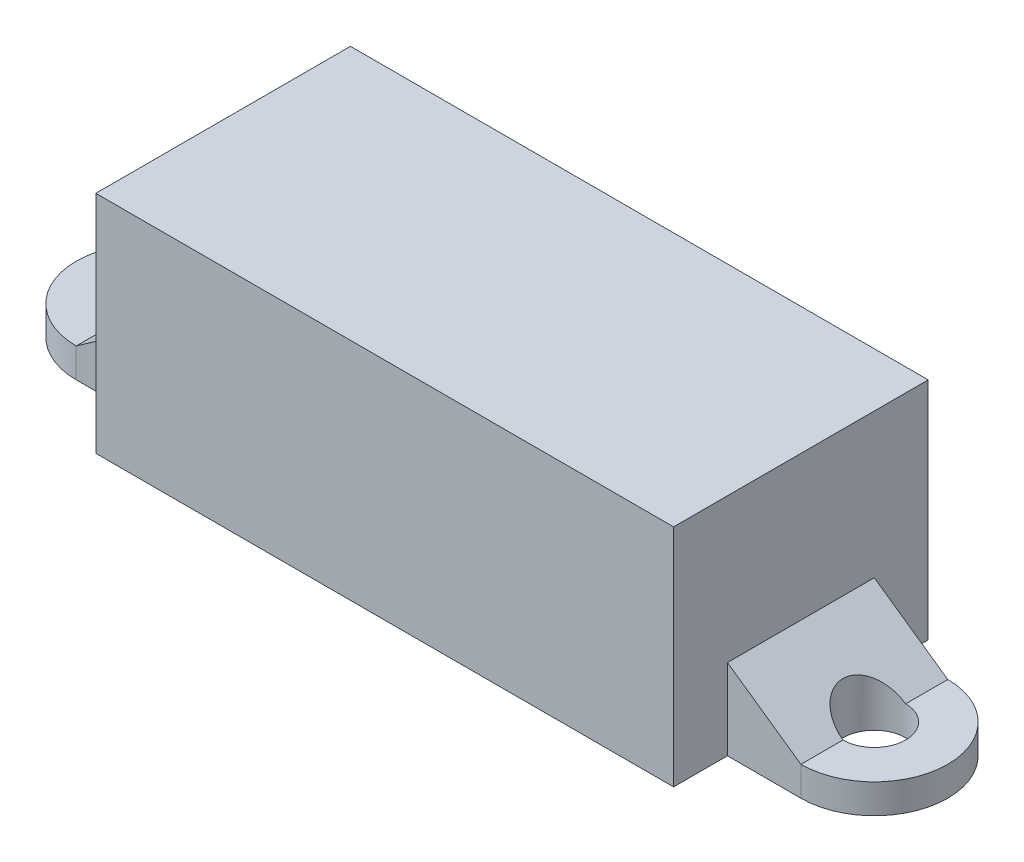
ISO-10303-21;
HEADER;
FILE_DESCRIPTION(('STEP AP214'),'2;1');
FILE_NAME('part.step','',(''),(''),'','','');
FILE_SCHEMA(('AUTOMOTIVE_DESIGN { 1 0 10303 214 1 1 1 1 }'));
ENDSEC;
DATA;
#1=APPLICATION_CONTEXT('core data for automotive mechanical design processes');
#2=APPLICATION_PROTOCOL_DEFINITION('international standard','automotive_design',2000,#1);
#3=PRODUCT_CONTEXT('',#1,'mechanical');
#4=PRODUCT('Part','Part','',(#3));
#5=PRODUCT_RELATED_PRODUCT_CATEGORY('part','',(#4));
#6=PRODUCT_DEFINITION_FORMATION('','',#4);
#7=PRODUCT_DEFINITION_CONTEXT('part definition',#1,'design');
#8=PRODUCT_DEFINITION('design','',#6,#7);
#9=PRODUCT_DEFINITION_SHAPE('','',#8);
#10=(LENGTH_UNIT() NAMED_UNIT(*) SI_UNIT(.MILLI.,.METRE.));
#11=(NAMED_UNIT(*) PLANE_ANGLE_UNIT() SI_UNIT($,.RADIAN.));
#12=(NAMED_UNIT(*) SI_UNIT($,.STERADIAN.) SOLID_ANGLE_UNIT());
#13=UNCERTAINTY_MEASURE_WITH_UNIT(LENGTH_MEASURE(1.E-05),#10,'distance_accuracy_value','');
#14=(GEOMETRIC_REPRESENTATION_CONTEXT(3) GLOBAL_UNCERTAINTY_ASSIGNED_CONTEXT((#13)) GLOBAL_UNIT_ASSIGNED_CONTEXT((#10,
#11,#12)) REPRESENTATION_CONTEXT('',''));
#15=CARTESIAN_POINT('',(0.,0.,0.));
#16=DIRECTION('',(0.,0.,1.));
#17=DIRECTION('',(1.,0.,0.));
#18=AXIS2_PLACEMENT_3D('',#15,#16,#17);
#19=CARTESIAN_POINT('',(-18.5,11.5,0.));
#20=DIRECTION('',(0.,1.,0.));
#21=DIRECTION('',(0.,0.,1.));
#22=AXIS2_PLACEMENT_3D('',#19,#20,#21);
#23=PLANE('',#22);
#24=DIRECTION('',(1.,0.,0.));
#25=VECTOR('',#24,1.);
#26=CARTESIAN_POINT('',(-14.75,11.5,6.5));
#27=LINE('',#26,#25);
#28=CARTESIAN_POINT('',(-14.75,11.5,6.5));
#29=VERTEX_POINT('',#28);
#30=CARTESIAN_POINT('',(14.75,11.5,6.5));
#31=VERTEX_POINT('',#30);
#32=EDGE_CURVE('E170',#29,#31,#27,.T.);
#33=ORIENTED_EDGE('',*,*,#32,.T.);
#34=DIRECTION('',(0.,0.,-1.));
#35=VECTOR('',#34,1.);
#36=CARTESIAN_POINT('',(14.75,11.5,-3.75));
#37=LINE('',#36,#35);
#38=CARTESIAN_POINT('',(14.75,11.5,-6.5));
#39=VERTEX_POINT('',#38);
#40=EDGE_CURVE('E227',#31,#39,#37,.T.);
#41=ORIENTED_EDGE('',*,*,#40,.T.);
#42=DIRECTION('',(-1.,0.,0.));
#43=VECTOR('',#42,1.);
#44=CARTESIAN_POINT('',(-14.75,11.5,-6.5));
#45=LINE('',#44,#43);
#46=CARTESIAN_POINT('',(-14.75,11.5,-6.5));
#47=VERTEX_POINT('',#46);
#48=EDGE_CURVE('E230',#39,#47,#45,.T.);
#49=ORIENTED_EDGE('',*,*,#48,.T.);
#50=DIRECTION('',(0.,0.,1.));
#51=VECTOR('',#50,1.);
#52=CARTESIAN_POINT('',(-14.75,11.5,-3.75));
#53=LINE('',#52,#51);
#54=EDGE_CURVE('E233',#47,#29,#53,.T.);
#55=ORIENTED_EDGE('',*,*,#54,.T.);
#56=EDGE_LOOP('',(#33,#41,#49,#55));
#57=FACE_BOUND('',#56,.T.);
#58=ADVANCED_FACE('F33',(#57),#23,.T.);
#59=CARTESIAN_POINT('',(18.5,11.5,3.75));
#60=DIRECTION('',(0.,0.,-1.));
#61=DIRECTION('',(-1.,0.,0.));
#62=AXIS2_PLACEMENT_3D('',#59,#60,#61);
#63=PLANE('',#62);
#64=DIRECTION('',(0.819152044288991,-0.573576436351047,0.));
#65=VECTOR('',#64,1.);
#66=CARTESIAN_POINT('',(13.8015368960705,4.78989928337167,3.75));
#67=LINE('',#66,#65);
#68=CARTESIAN_POINT('',(14.75,4.12577826828643,3.75));
#69=VERTEX_POINT('',#68);
#70=CARTESIAN_POINT('',(18.5,1.5,3.75));
#71=VERTEX_POINT('',#70);
#72=EDGE_CURVE('E145',#69,#71,#67,.T.);
#73=ORIENTED_EDGE('',*,*,#72,.F.);
#74=DIRECTION('',(0.,-1.,0.));
#75=VECTOR('',#74,1.);
#76=CARTESIAN_POINT('',(14.75,11.5,3.75));
#77=LINE('',#76,#75);
#78=CARTESIAN_POINT('',(14.75,0.,3.75));
#79=VERTEX_POINT('',#78);
#80=EDGE_CURVE('E168',#69,#79,#77,.T.);
#81=ORIENTED_EDGE('',*,*,#80,.T.);
#82=DIRECTION('',(1.,0.,0.));
#83=VECTOR('',#82,1.);
#84=CARTESIAN_POINT('',(18.5,0.,3.75));
#85=LINE('',#84,#83);
#86=CARTESIAN_POINT('',(18.5,0.,3.75));
#87=VERTEX_POINT('',#86);
#88=EDGE_CURVE('E260',#79,#87,#85,.T.);
#89=ORIENTED_EDGE('',*,*,#88,.T.);
#90=DIRECTION('',(0.,-1.,0.));
#91=VECTOR('',#90,1.);
#92=CARTESIAN_POINT('',(18.5,11.5,3.75));
#93=LINE('',#92,#91);
#94=EDGE_CURVE('E166',#71,#87,#93,.T.);
#95=ORIENTED_EDGE('',*,*,#94,.F.);
#96=EDGE_LOOP('',(#73,#81,#89,#95));
#97=FACE_BOUND('',#96,.T.);
#98=ADVANCED_FACE('F283',(#97),#63,.F.);
#99=CARTESIAN_POINT('',(18.5,11.5,0.));
#100=DIRECTION('',(0.,-1.,0.));
#101=DIRECTION('',(0.,0.,-1.));
#102=AXIS2_PLACEMENT_3D('',#99,#100,#101);
#103=CYLINDRICAL_SURFACE('',#102,3.75);
#104=CARTESIAN_POINT('',(18.5,1.5,0.));
#105=DIRECTION('',(0.,1.,0.));
#106=DIRECTION('',(-1.,0.,0.));
#107=AXIS2_PLACEMENT_3D('',#104,#105,#106);
#108=CIRCLE('',#107,3.75);
#109=CARTESIAN_POINT('',(18.5,1.5,-3.75));
#110=VERTEX_POINT('',#109);
#111=EDGE_CURVE('E134',#71,#110,#108,.T.);
#112=ORIENTED_EDGE('',*,*,#111,.F.);
#113=ORIENTED_EDGE('',*,*,#94,.T.);
#114=CARTESIAN_POINT('',(18.5,0.,0.));
#115=DIRECTION('',(0.,1.,0.));
#116=DIRECTION('',(0.,0.,-1.));
#117=AXIS2_PLACEMENT_3D('',#114,#115,#116);
#118=CIRCLE('',#117,3.75);
#119=CARTESIAN_POINT('',(18.5,0.,-3.75));
#120=VERTEX_POINT('',#119);
#121=EDGE_CURVE('E164',#87,#120,#118,.T.);
#122=ORIENTED_EDGE('',*,*,#121,.T.);
#123=DIRECTION('',(0.,-1.,0.));
#124=VECTOR('',#123,1.);
#125=CARTESIAN_POINT('',(18.5,11.5,-3.75));
#126=LINE('',#125,#124);
#127=EDGE_CURVE('E158',#110,#120,#126,.T.);
#128=ORIENTED_EDGE('',*,*,#127,.F.);
#129=EDGE_LOOP('',(#112,#113,#122,#128));
#130=FACE_BOUND('',#129,.T.);
#131=ADVANCED_FACE('F162',(#130),#103,.T.);
#132=CARTESIAN_POINT('',(18.5,11.5,-3.75));
#133=DIRECTION('',(0.,0.,1.));
#134=DIRECTION('',(1.,0.,0.));
#135=AXIS2_PLACEMENT_3D('',#132,#133,#134);
#136=PLANE('',#135);
#137=DIRECTION('',(-0.819152044288991,0.573576436351047,0.));
#138=VECTOR('',#137,1.);
#139=CARTESIAN_POINT('',(13.8015368960705,4.78989928337167,-3.74999999999999));
#140=LINE('',#139,#138);
#141=CARTESIAN_POINT('',(14.75,4.12577826828643,-3.75));
#142=VERTEX_POINT('',#141);
#143=EDGE_CURVE('E150',#110,#142,#140,.T.);
#144=ORIENTED_EDGE('',*,*,#143,.F.);
#145=ORIENTED_EDGE('',*,*,#127,.T.);
#146=DIRECTION('',(-1.,0.,0.));
#147=VECTOR('',#146,1.);
#148=CARTESIAN_POINT('',(18.5,0.,-3.75));
#149=LINE('',#148,#147);
#150=CARTESIAN_POINT('',(14.75,0.,-3.75));
#151=VERTEX_POINT('',#150);
#152=EDGE_CURVE('E231',#120,#151,#149,.T.);
#153=ORIENTED_EDGE('',*,*,#152,.T.);
#154=DIRECTION('',(0.,-1.,0.));
#155=VECTOR('',#154,1.);
#156=CARTESIAN_POINT('',(14.75,11.5,-3.75));
#157=LINE('',#156,#155);
#158=EDGE_CURVE('E160',#142,#151,#157,.T.);
#159=ORIENTED_EDGE('',*,*,#158,.F.);
#160=EDGE_LOOP('',(#144,#145,#153,#159));
#161=FACE_BOUND('',#160,.T.);
#162=ADVANCED_FACE('F156',(#161),#136,.F.);
#163=CARTESIAN_POINT('',(18.5,11.5,0.));
#164=DIRECTION('',(0.,-1.,0.));
#165=DIRECTION('',(0.,0.,-1.));
#166=AXIS2_PLACEMENT_3D('',#163,#164,#165);
#167=CYLINDRICAL_SURFACE('',#166,1.60000000000001);
#168=CARTESIAN_POINT('',(18.5,0.,0.));
#169=DIRECTION('',(0.,1.,0.));
#170=DIRECTION('',(0.,0.,-1.));
#171=AXIS2_PLACEMENT_3D('',#168,#169,#170);
#172=CIRCLE('',#171,1.60000000000001);
#173=CARTESIAN_POINT('',(18.5,0.,-1.60000000000001));
#174=VERTEX_POINT('',#173);
#175=EDGE_CURVE('E218',#174,#174,#172,.T.);
#176=ORIENTED_EDGE('',*,*,#175,.F.);
#177=EDGE_LOOP('',(#176));
#178=FACE_BOUND('',#177,.T.);
#179=CARTESIAN_POINT('',(18.5,1.5,0.));
#180=DIRECTION('',(0.573576436351047,0.819152044288991,0.));
#181=DIRECTION('',(0.819152044288991,-0.573576436351047,0.));
#182=AXIS2_PLACEMENT_3D('',#179,#180,#181);
#183=ELLIPSE('',#182,1.95323934201834,1.60000000000001);
#184=CARTESIAN_POINT('',(18.5,1.5,-1.60000000000001));
#185=VERTEX_POINT('',#184);
#186=CARTESIAN_POINT('',(18.5,1.5,1.6));
#187=VERTEX_POINT('',#186);
#188=EDGE_CURVE('E153',#185,#187,#183,.T.);
#189=ORIENTED_EDGE('',*,*,#188,.T.);
#190=CARTESIAN_POINT('',(18.5,1.5,0.));
#191=DIRECTION('',(0.,1.,0.));
#192=DIRECTION('',(-1.,0.,0.));
#193=AXIS2_PLACEMENT_3D('',#190,#191,#192);
#194=CIRCLE('',#193,1.60000000000001);
#195=EDGE_CURVE('E192',#187,#185,#194,.T.);
#196=ORIENTED_EDGE('',*,*,#195,.T.);
#197=EDGE_LOOP('',(#189,#196));
#198=FACE_BOUND('',#197,.T.);
#199=ADVANCED_FACE('F325',(#178,#198),#167,.F.);
#200=CARTESIAN_POINT('',(-18.5,0.,0.));
#201=DIRECTION('',(0.,1.,0.));
#202=DIRECTION('',(0.,0.,1.));
#203=AXIS2_PLACEMENT_3D('',#200,#201,#202);
#204=PLANE('',#203);
#205=DIRECTION('',(0.,0.,-1.));
#206=VECTOR('',#205,1.);
#207=CARTESIAN_POINT('',(14.75,0.,-3.75));
#208=LINE('',#207,#206);
#209=CARTESIAN_POINT('',(14.75,0.,-6.5));
#210=VERTEX_POINT('',#209);
#211=EDGE_CURVE('E217',#151,#210,#208,.T.);
#212=ORIENTED_EDGE('',*,*,#211,.F.);
#213=ORIENTED_EDGE('',*,*,#152,.F.);
#214=ORIENTED_EDGE('',*,*,#121,.F.);
#215=ORIENTED_EDGE('',*,*,#88,.F.);
#216=DIRECTION('',(0.,0.,-1.));
#217=VECTOR('',#216,1.);
#218=CARTESIAN_POINT('',(14.75,0.,6.5));
#219=LINE('',#218,#217);
#220=CARTESIAN_POINT('',(14.75,0.,6.5));
#221=VERTEX_POINT('',#220);
#222=EDGE_CURVE('E257',#221,#79,#219,.T.);
#223=ORIENTED_EDGE('',*,*,#222,.F.);
#224=DIRECTION('',(1.,0.,0.));
#225=VECTOR('',#224,1.);
#226=CARTESIAN_POINT('',(-14.75,0.,6.5));
#227=LINE('',#226,#225);
#228=CARTESIAN_POINT('',(-14.75,0.,6.5));
#229=VERTEX_POINT('',#228);
#230=EDGE_CURVE('E254',#229,#221,#227,.T.);
#231=ORIENTED_EDGE('',*,*,#230,.F.);
#232=DIRECTION('',(0.,0.,1.));
#233=VECTOR('',#232,1.);
#234=CARTESIAN_POINT('',(-14.75,0.,6.5));
#235=LINE('',#234,#233);
#236=CARTESIAN_POINT('',(-14.75,0.,3.75));
#237=VERTEX_POINT('',#236);
#238=EDGE_CURVE('E251',#237,#229,#235,.T.);
#239=ORIENTED_EDGE('',*,*,#238,.F.);
#240=DIRECTION('',(1.,0.,0.));
#241=VECTOR('',#240,1.);
#242=CARTESIAN_POINT('',(-18.5,0.,3.75));
#243=LINE('',#242,#241);
#244=CARTESIAN_POINT('',(-18.5,0.,3.75));
#245=VERTEX_POINT('',#244);
#246=EDGE_CURVE('E248',#245,#237,#243,.T.);
#247=ORIENTED_EDGE('',*,*,#246,.F.);
#248=CARTESIAN_POINT('',(-18.5,0.,0.));
#249=DIRECTION('',(0.,1.,0.));
#250=DIRECTION('',(0.,0.,1.));
#251=AXIS2_PLACEMENT_3D('',#248,#249,#250);
#252=CIRCLE('',#251,3.75);
#253=CARTESIAN_POINT('',(-18.5,0.,-3.75));
#254=VERTEX_POINT('',#253);
#255=EDGE_CURVE('E245',#254,#245,#252,.T.);
#256=ORIENTED_EDGE('',*,*,#255,.F.);
#257=DIRECTION('',(-1.,0.,0.));
#258=VECTOR('',#257,1.);
#259=CARTESIAN_POINT('',(-18.5,0.,-3.75));
#260=LINE('',#259,#258);
#261=CARTESIAN_POINT('',(-14.75,0.,-3.75));
#262=VERTEX_POINT('',#261);
#263=EDGE_CURVE('E242',#262,#254,#260,.T.);
#264=ORIENTED_EDGE('',*,*,#263,.F.);
#265=DIRECTION('',(0.,0.,1.));
#266=VECTOR('',#265,1.);
#267=CARTESIAN_POINT('',(-14.75,0.,-3.75));
#268=LINE('',#267,#266);
#269=CARTESIAN_POINT('',(-14.75,0.,-6.5));
#270=VERTEX_POINT('',#269);
#271=EDGE_CURVE('E239',#270,#262,#268,.T.);
#272=ORIENTED_EDGE('',*,*,#271,.F.);
#273=DIRECTION('',(-1.,0.,0.));
#274=VECTOR('',#273,1.);
#275=CARTESIAN_POINT('',(-14.75,0.,-6.5));
#276=LINE('',#275,#274);
#277=EDGE_CURVE('E221',#210,#270,#276,.T.);
#278=ORIENTED_EDGE('',*,*,#277,.F.);
#279=EDGE_LOOP('',(#212,#213,#214,#215,#223,#231,#239,#247,#256,#264,#272,#278));
#280=FACE_BOUND('',#279,.T.);
#281=CARTESIAN_POINT('',(-18.5,0.,0.));
#282=DIRECTION('',(0.,1.,0.));
#283=DIRECTION('',(0.,0.,1.));
#284=AXIS2_PLACEMENT_3D('',#281,#282,#283);
#285=CIRCLE('',#284,1.6);
#286=CARTESIAN_POINT('',(-18.5,0.,1.6));
#287=VERTEX_POINT('',#286);
#288=EDGE_CURVE('E215',#287,#287,#285,.T.);
#289=ORIENTED_EDGE('',*,*,#288,.T.);
#290=EDGE_LOOP('',(#289));
#291=FACE_BOUND('',#290,.T.);
#292=ORIENTED_EDGE('',*,*,#175,.T.);
#293=EDGE_LOOP('',(#292));
#294=FACE_BOUND('',#293,.T.);
#295=ADVANCED_FACE('F266',(#280,#291,#294),#204,.F.);
#296=CARTESIAN_POINT('',(-14.75,11.5,-6.5));
#297=DIRECTION('',(0.,0.,1.));
#298=DIRECTION('',(1.,0.,0.));
#299=AXIS2_PLACEMENT_3D('',#296,#297,#298);
#300=PLANE('',#299);
#301=ORIENTED_EDGE('',*,*,#277,.T.);
#302=DIRECTION('',(0.,-1.,0.));
#303=VECTOR('',#302,1.);
#304=CARTESIAN_POINT('',(-14.75,11.5,-6.5));
#305=LINE('',#304,#303);
#306=EDGE_CURVE('E187',#47,#270,#305,.T.);
#307=ORIENTED_EDGE('',*,*,#306,.F.);
#308=ORIENTED_EDGE('',*,*,#48,.F.);
#309=DIRECTION('',(0.,-1.,0.));
#310=VECTOR('',#309,1.);
#311=CARTESIAN_POINT('',(14.75,11.5,-6.5));
#312=LINE('',#311,#310);
#313=EDGE_CURVE('E189',#39,#210,#312,.T.);
#314=ORIENTED_EDGE('',*,*,#313,.T.);
#315=EDGE_LOOP('',(#301,#307,#308,#314));
#316=FACE_BOUND('',#315,.T.);
#317=ADVANCED_FACE('F35',(#316),#300,.F.);
#318=CARTESIAN_POINT('',(-18.5,11.5,-3.75));
#319=DIRECTION('',(0.,0.,1.));
#320=DIRECTION('',(1.,0.,0.));
#321=AXIS2_PLACEMENT_3D('',#318,#319,#320);
#322=PLANE('',#321);
#323=DIRECTION('',(0.,-1.,0.));
#324=VECTOR('',#323,1.);
#325=CARTESIAN_POINT('',(-18.5,11.5,-3.75));
#326=LINE('',#325,#324);
#327=CARTESIAN_POINT('',(-18.5,1.5,-3.75));
#328=VERTEX_POINT('',#327);
#329=EDGE_CURVE('E183',#328,#254,#326,.T.);
#330=ORIENTED_EDGE('',*,*,#329,.F.);
#331=DIRECTION('',(0.819152044288991,0.573576436351047,0.));
#332=VECTOR('',#331,1.);
#333=CARTESIAN_POINT('',(-13.8015368960705,4.78989928337168,-3.75));
#334=LINE('',#333,#332);
#335=CARTESIAN_POINT('',(-14.75,4.12577826828643,-3.75));
#336=VERTEX_POINT('',#335);
#337=EDGE_CURVE('E205',#328,#336,#334,.T.);
#338=ORIENTED_EDGE('',*,*,#337,.T.);
#339=DIRECTION('',(0.,-1.,0.));
#340=VECTOR('',#339,1.);
#341=CARTESIAN_POINT('',(-14.75,11.5,-3.75));
#342=LINE('',#341,#340);
#343=EDGE_CURVE('E185',#336,#262,#342,.T.);
#344=ORIENTED_EDGE('',*,*,#343,.T.);
#345=ORIENTED_EDGE('',*,*,#263,.T.);
#346=EDGE_LOOP('',(#330,#338,#344,#345));
#347=FACE_BOUND('',#346,.T.);
#348=ADVANCED_FACE('F291',(#347),#322,.F.);
#349=CARTESIAN_POINT('',(-18.5,11.5,0.));
#350=DIRECTION('',(0.,-1.,0.));
#351=DIRECTION('',(0.,0.,-1.));
#352=AXIS2_PLACEMENT_3D('',#349,#350,#351);
#353=CYLINDRICAL_SURFACE('',#352,3.75);
#354=DIRECTION('',(0.,-1.,0.));
#355=VECTOR('',#354,1.);
#356=CARTESIAN_POINT('',(-18.5,11.5,3.75));
#357=LINE('',#356,#355);
#358=CARTESIAN_POINT('',(-18.5,1.50000000000001,3.75));
#359=VERTEX_POINT('',#358);
#360=EDGE_CURVE('E181',#359,#245,#357,.T.);
#361=ORIENTED_EDGE('',*,*,#360,.F.);
#362=CARTESIAN_POINT('',(-18.5,1.5,0.));
#363=DIRECTION('',(0.,-1.,0.));
#364=DIRECTION('',(1.,0.,0.));
#365=AXIS2_PLACEMENT_3D('',#362,#363,#364);
#366=CIRCLE('',#365,3.75);
#367=EDGE_CURVE('E144',#359,#328,#366,.T.);
#368=ORIENTED_EDGE('',*,*,#367,.T.);
#369=ORIENTED_EDGE('',*,*,#329,.T.);
#370=ORIENTED_EDGE('',*,*,#255,.T.);
#371=EDGE_LOOP('',(#361,#368,#369,#370));
#372=FACE_BOUND('',#371,.T.);
#373=ADVANCED_FACE('F302',(#372),#353,.T.);
#374=CARTESIAN_POINT('',(-18.5,11.5,3.75));
#375=DIRECTION('',(0.,0.,-1.));
#376=DIRECTION('',(-1.,0.,0.));
#377=AXIS2_PLACEMENT_3D('',#374,#375,#376);
#378=PLANE('',#377);
#379=DIRECTION('',(0.,-1.,0.));
#380=VECTOR('',#379,1.);
#381=CARTESIAN_POINT('',(-14.75,11.5,3.75));
#382=LINE('',#381,#380);
#383=CARTESIAN_POINT('',(-14.75,4.12577826828643,3.75));
#384=VERTEX_POINT('',#383);
#385=EDGE_CURVE('E179',#384,#237,#382,.T.);
#386=ORIENTED_EDGE('',*,*,#385,.F.);
#387=DIRECTION('',(-0.819152044288991,-0.573576436351047,0.));
#388=VECTOR('',#387,1.);
#389=CARTESIAN_POINT('',(-13.8015368960705,4.78989928337168,3.75));
#390=LINE('',#389,#388);
#391=EDGE_CURVE('E287',#384,#359,#390,.T.);
#392=ORIENTED_EDGE('',*,*,#391,.T.);
#393=ORIENTED_EDGE('',*,*,#360,.T.);
#394=ORIENTED_EDGE('',*,*,#246,.T.);
#395=EDGE_LOOP('',(#386,#392,#393,#394));
#396=FACE_BOUND('',#395,.T.);
#397=ADVANCED_FACE('F304',(#396),#378,.F.);
#398=CARTESIAN_POINT('',(-14.75,11.5,6.5));
#399=DIRECTION('',(1.,0.,0.));
#400=DIRECTION('',(0.,0.,-1.));
#401=AXIS2_PLACEMENT_3D('',#398,#399,#400);
#402=PLANE('',#401);
#403=ORIENTED_EDGE('',*,*,#238,.T.);
#404=DIRECTION('',(0.,-1.,0.));
#405=VECTOR('',#404,1.);
#406=CARTESIAN_POINT('',(-14.75,11.5,6.5));
#407=LINE('',#406,#405);
#408=EDGE_CURVE('E177',#29,#229,#407,.T.);
#409=ORIENTED_EDGE('',*,*,#408,.F.);
#410=ORIENTED_EDGE('',*,*,#54,.F.);
#411=ORIENTED_EDGE('',*,*,#306,.T.);
#412=ORIENTED_EDGE('',*,*,#271,.T.);
#413=ORIENTED_EDGE('',*,*,#343,.F.);
#414=DIRECTION('',(0.,0.,1.));
#415=VECTOR('',#414,1.);
#416=CARTESIAN_POINT('',(-14.75,4.12577826828643,-6.5));
#417=LINE('',#416,#415);
#418=EDGE_CURVE('E206',#336,#384,#417,.T.);
#419=ORIENTED_EDGE('',*,*,#418,.T.);
#420=ORIENTED_EDGE('',*,*,#385,.T.);
#421=EDGE_LOOP('',(#403,#409,#410,#411,#412,#413,#419,#420));
#422=FACE_BOUND('',#421,.T.);
#423=ADVANCED_FACE('F294',(#422),#402,.F.);
#424=CARTESIAN_POINT('',(-14.75,11.5,6.5));
#425=DIRECTION('',(0.,0.,-1.));
#426=DIRECTION('',(-1.,0.,0.));
#427=AXIS2_PLACEMENT_3D('',#424,#425,#426);
#428=PLANE('',#427);
#429=ORIENTED_EDGE('',*,*,#230,.T.);
#430=DIRECTION('',(0.,-1.,0.));
#431=VECTOR('',#430,1.);
#432=CARTESIAN_POINT('',(14.75,11.5,6.5));
#433=LINE('',#432,#431);
#434=EDGE_CURVE('E175',#31,#221,#433,.T.);
#435=ORIENTED_EDGE('',*,*,#434,.F.);
#436=ORIENTED_EDGE('',*,*,#32,.F.);
#437=ORIENTED_EDGE('',*,*,#408,.T.);
#438=EDGE_LOOP('',(#429,#435,#436,#437));
#439=FACE_BOUND('',#438,.T.);
#440=ADVANCED_FACE('F277',(#439),#428,.F.);
#441=CARTESIAN_POINT('',(14.75,11.5,6.5));
#442=DIRECTION('',(-1.,0.,0.));
#443=DIRECTION('',(0.,0.,1.));
#444=AXIS2_PLACEMENT_3D('',#441,#442,#443);
#445=PLANE('',#444);
#446=ORIENTED_EDGE('',*,*,#434,.T.);
#447=ORIENTED_EDGE('',*,*,#222,.T.);
#448=ORIENTED_EDGE('',*,*,#80,.F.);
#449=DIRECTION('',(0.,0.,1.));
#450=VECTOR('',#449,1.);
#451=CARTESIAN_POINT('',(14.75,4.12577826828643,-6.5));
#452=LINE('',#451,#450);
#453=EDGE_CURVE('E55',#142,#69,#452,.T.);
#454=ORIENTED_EDGE('',*,*,#453,.F.);
#455=ORIENTED_EDGE('',*,*,#158,.T.);
#456=ORIENTED_EDGE('',*,*,#211,.T.);
#457=ORIENTED_EDGE('',*,*,#313,.F.);
#458=ORIENTED_EDGE('',*,*,#40,.F.);
#459=EDGE_LOOP('',(#446,#447,#448,#454,#455,#456,#457,#458));
#460=FACE_BOUND('',#459,.T.);
#461=ADVANCED_FACE('F211',(#460),#445,.F.);
#462=CARTESIAN_POINT('',(-18.5,11.5,0.));
#463=DIRECTION('',(0.,-1.,0.));
#464=DIRECTION('',(0.,0.,-1.));
#465=AXIS2_PLACEMENT_3D('',#462,#463,#464);
#466=CYLINDRICAL_SURFACE('',#465,1.6);
#467=CARTESIAN_POINT('',(-18.5,1.50000000000001,0.));
#468=DIRECTION('',(0.573576436351047,-0.819152044288991,0.));
#469=DIRECTION('',(-0.819152044288991,-0.573576436351047,0.));
#470=AXIS2_PLACEMENT_3D('',#467,#468,#469);
#471=ELLIPSE('',#470,1.95323934201833,1.6);
#472=CARTESIAN_POINT('',(-18.5,1.5,-1.6));
#473=VERTEX_POINT('',#472);
#474=CARTESIAN_POINT('',(-18.5,1.5,1.6));
#475=VERTEX_POINT('',#474);
#476=EDGE_CURVE('E11',#473,#475,#471,.T.);
#477=ORIENTED_EDGE('',*,*,#476,.F.);
#478=CARTESIAN_POINT('',(-18.5,1.5,0.));
#479=DIRECTION('',(0.,-1.,0.));
#480=DIRECTION('',(1.,0.,0.));
#481=AXIS2_PLACEMENT_3D('',#478,#479,#480);
#482=CIRCLE('',#481,1.6);
#483=EDGE_CURVE('E41',#475,#473,#482,.T.);
#484=ORIENTED_EDGE('',*,*,#483,.F.);
#485=EDGE_LOOP('',(#477,#484));
#486=FACE_BOUND('',#485,.T.);
#487=ORIENTED_EDGE('',*,*,#288,.F.);
#488=EDGE_LOOP('',(#487));
#489=FACE_BOUND('',#488,.T.);
#490=ADVANCED_FACE('F208',(#486,#489),#466,.F.);
#491=CARTESIAN_POINT('',(0.,1.5,-6.5));
#492=DIRECTION('',(0.,1.,0.));
#493=DIRECTION('',(-1.,0.,0.));
#494=AXIS2_PLACEMENT_3D('',#491,#492,#493);
#495=PLANE('',#494);
#496=ORIENTED_EDGE('',*,*,#111,.T.);
#497=DIRECTION('',(0.,0.,1.));
#498=VECTOR('',#497,1.);
#499=CARTESIAN_POINT('',(18.5,1.5,-6.5));
#500=LINE('',#499,#498);
#501=EDGE_CURVE('E138',#110,#185,#500,.T.);
#502=ORIENTED_EDGE('',*,*,#501,.T.);
#503=ORIENTED_EDGE('',*,*,#195,.F.);
#504=EDGE_CURVE('E140',#187,#71,#500,.T.);
#505=ORIENTED_EDGE('',*,*,#504,.T.);
#506=EDGE_LOOP('',(#496,#502,#503,#505));
#507=FACE_BOUND('',#506,.T.);
#508=ADVANCED_FACE('F136',(#507),#495,.T.);
#509=CARTESIAN_POINT('',(6.79108313982702,9.69867184976392,-6.5));
#510=DIRECTION('',(0.573576436351047,0.819152044288991,0.));
#511=DIRECTION('',(-0.819152044288991,0.573576436351047,0.));
#512=AXIS2_PLACEMENT_3D('',#509,#510,#511);
#513=PLANE('',#512);
#514=ORIENTED_EDGE('',*,*,#72,.T.);
#515=ORIENTED_EDGE('',*,*,#504,.F.);
#516=ORIENTED_EDGE('',*,*,#188,.F.);
#517=ORIENTED_EDGE('',*,*,#501,.F.);
#518=ORIENTED_EDGE('',*,*,#143,.T.);
#519=ORIENTED_EDGE('',*,*,#453,.T.);
#520=EDGE_LOOP('',(#514,#515,#516,#517,#518,#519));
#521=FACE_BOUND('',#520,.T.);
#522=ADVANCED_FACE('F149',(#521),#513,.T.);
#523=CARTESIAN_POINT('',(-6.79108313982703,9.69867184976392,-6.5));
#524=DIRECTION('',(0.573576436351047,-0.819152044288991,0.));
#525=DIRECTION('',(0.819152044288991,0.573576436351047,0.));
#526=AXIS2_PLACEMENT_3D('',#523,#524,#525);
#527=PLANE('',#526);
#528=DIRECTION('',(0.,0.,1.));
#529=VECTOR('',#528,1.);
#530=CARTESIAN_POINT('',(-18.5,1.5,-6.5));
#531=LINE('',#530,#529);
#532=EDGE_CURVE('E198',#328,#473,#531,.T.);
#533=ORIENTED_EDGE('',*,*,#532,.T.);
#534=ORIENTED_EDGE('',*,*,#476,.T.);
#535=EDGE_CURVE('E47',#475,#359,#531,.T.);
#536=ORIENTED_EDGE('',*,*,#535,.T.);
#537=ORIENTED_EDGE('',*,*,#391,.F.);
#538=ORIENTED_EDGE('',*,*,#418,.F.);
#539=ORIENTED_EDGE('',*,*,#337,.F.);
#540=EDGE_LOOP('',(#533,#534,#536,#537,#538,#539));
#541=FACE_BOUND('',#540,.T.);
#542=ADVANCED_FACE('F203',(#541),#527,.F.);
#543=CARTESIAN_POINT('',(0.,1.5,-6.5));
#544=DIRECTION('',(0.,-1.,0.));
#545=DIRECTION('',(1.,0.,0.));
#546=AXIS2_PLACEMENT_3D('',#543,#544,#545);
#547=PLANE('',#546);
#548=ORIENTED_EDGE('',*,*,#535,.F.);
#549=ORIENTED_EDGE('',*,*,#483,.T.);
#550=ORIENTED_EDGE('',*,*,#532,.F.);
#551=ORIENTED_EDGE('',*,*,#367,.F.);
#552=EDGE_LOOP('',(#548,#549,#550,#551));
#553=FACE_BOUND('',#552,.T.);
#554=ADVANCED_FACE('F197',(#553),#547,.F.);
#555=CLOSED_SHELL('',(#58,#98,#131,#162,#199,#295,#317,#348,#373,#397,#423,#440,#461,#490,#508,
#522,#542,#554));
#556=MANIFOLD_SOLID_BREP('B2',#555);
#557=ADVANCED_BREP_SHAPE_REPRESENTATION('',(#18,#556),#14);
#558=SHAPE_DEFINITION_REPRESENTATION(#9,#557);
ENDSEC;
END-ISO-10303-21;
